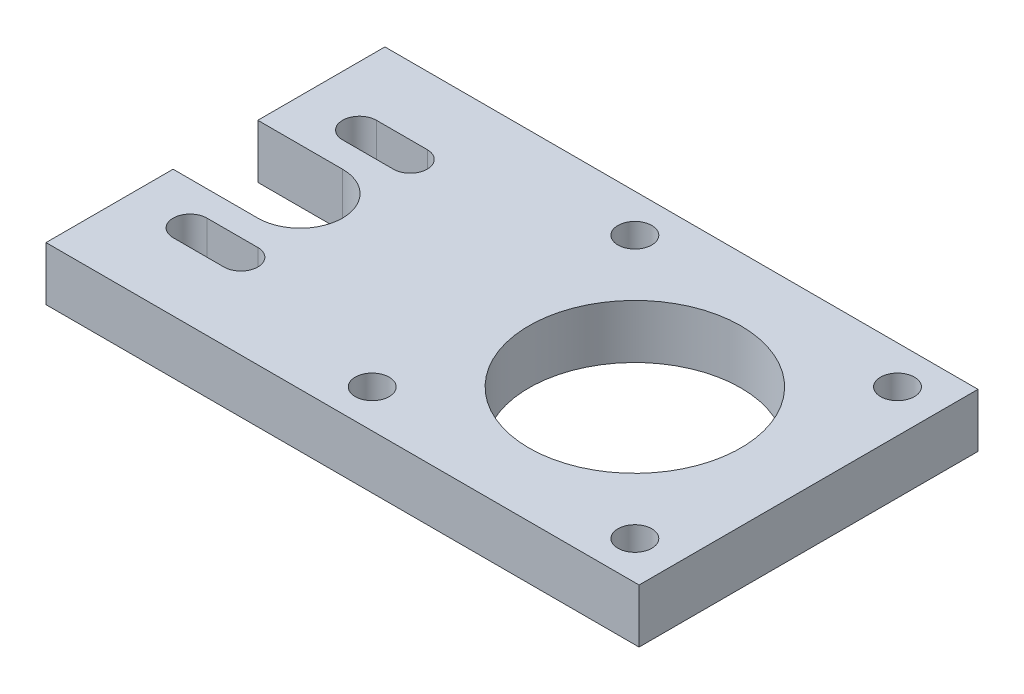
ISO-10303-21;
HEADER;
FILE_DESCRIPTION(('STEP AP214'),'2;1');
FILE_NAME('part.step','',(''),(''),'','','');
FILE_SCHEMA(('AUTOMOTIVE_DESIGN { 1 0 10303 214 1 1 1 1 }'));
ENDSEC;
DATA;
#1=APPLICATION_CONTEXT('core data for automotive mechanical design processes');
#2=APPLICATION_PROTOCOL_DEFINITION('international standard','automotive_design',2000,#1);
#3=PRODUCT_CONTEXT('',#1,'mechanical');
#4=PRODUCT('Part','Part','',(#3));
#5=PRODUCT_RELATED_PRODUCT_CATEGORY('part','',(#4));
#6=PRODUCT_DEFINITION_FORMATION('','',#4);
#7=PRODUCT_DEFINITION_CONTEXT('part definition',#1,'design');
#8=PRODUCT_DEFINITION('design','',#6,#7);
#9=PRODUCT_DEFINITION_SHAPE('','',#8);
#10=(LENGTH_UNIT() NAMED_UNIT(*) SI_UNIT(.MILLI.,.METRE.));
#11=(NAMED_UNIT(*) PLANE_ANGLE_UNIT() SI_UNIT($,.RADIAN.));
#12=(NAMED_UNIT(*) SI_UNIT($,.STERADIAN.) SOLID_ANGLE_UNIT());
#13=UNCERTAINTY_MEASURE_WITH_UNIT(LENGTH_MEASURE(1.E-05),#10,'distance_accuracy_value','');
#14=(GEOMETRIC_REPRESENTATION_CONTEXT(3) GLOBAL_UNCERTAINTY_ASSIGNED_CONTEXT((#13)) GLOBAL_UNIT_ASSIGNED_CONTEXT((#10,
#11,#12)) REPRESENTATION_CONTEXT('',''));
#15=CARTESIAN_POINT('',(0.,0.,0.));
#16=DIRECTION('',(0.,0.,1.));
#17=DIRECTION('',(1.,0.,0.));
#18=AXIS2_PLACEMENT_3D('',#15,#16,#17);
#19=CARTESIAN_POINT('',(0.,6.35,0.));
#20=DIRECTION('',(1.,0.,0.));
#21=DIRECTION('',(0.,0.,-1.));
#22=AXIS2_PLACEMENT_3D('',#19,#20,#21);
#23=PLANE('',#22);
#24=DIRECTION('',(0.,0.,1.));
#25=VECTOR('',#24,1.);
#26=CARTESIAN_POINT('',(0.,6.35,0.));
#27=LINE('',#26,#25);
#28=CARTESIAN_POINT('',(0.,6.35,-15.));
#29=VERTEX_POINT('',#28);
#30=CARTESIAN_POINT('',(0.,6.35,0.));
#31=VERTEX_POINT('',#30);
#32=EDGE_CURVE('E275',#29,#31,#27,.T.);
#33=ORIENTED_EDGE('',*,*,#32,.F.);
#34=DIRECTION('',(0.,1.,0.));
#35=VECTOR('',#34,1.);
#36=CARTESIAN_POINT('',(0.,0.,-15.));
#37=LINE('',#36,#35);
#38=CARTESIAN_POINT('',(0.,0.,-15.));
#39=VERTEX_POINT('',#38);
#40=EDGE_CURVE('E235',#39,#29,#37,.T.);
#41=ORIENTED_EDGE('',*,*,#40,.F.);
#42=DIRECTION('',(0.,0.,1.));
#43=VECTOR('',#42,1.);
#44=CARTESIAN_POINT('',(0.,0.,0.));
#45=LINE('',#44,#43);
#46=CARTESIAN_POINT('',(0.,0.,0.));
#47=VERTEX_POINT('',#46);
#48=EDGE_CURVE('E268',#39,#47,#45,.T.);
#49=ORIENTED_EDGE('',*,*,#48,.T.);
#50=DIRECTION('',(0.,-1.,0.));
#51=VECTOR('',#50,1.);
#52=CARTESIAN_POINT('',(0.,6.35,0.));
#53=LINE('',#52,#51);
#54=EDGE_CURVE('E11',#31,#47,#53,.T.);
#55=ORIENTED_EDGE('',*,*,#54,.F.);
#56=EDGE_LOOP('',(#33,#41,#49,#55));
#57=FACE_BOUND('',#56,.T.);
#58=ADVANCED_FACE('F33',(#57),#23,.F.);
#59=CARTESIAN_POINT('',(0.,0.,-40.));
#60=VERTEX_POINT('',#59);
#61=CARTESIAN_POINT('',(0.,0.,-25.));
#62=VERTEX_POINT('',#61);
#63=EDGE_CURVE('E282',#60,#62,#45,.T.);
#64=ORIENTED_EDGE('',*,*,#63,.T.);
#65=DIRECTION('',(0.,1.,0.));
#66=VECTOR('',#65,1.);
#67=CARTESIAN_POINT('',(0.,0.,-25.));
#68=LINE('',#67,#66);
#69=CARTESIAN_POINT('',(0.,6.35,-25.));
#70=VERTEX_POINT('',#69);
#71=EDGE_CURVE('E237',#62,#70,#68,.T.);
#72=ORIENTED_EDGE('',*,*,#71,.T.);
#73=CARTESIAN_POINT('',(0.,6.35,-40.));
#74=VERTEX_POINT('',#73);
#75=EDGE_CURVE('E271',#74,#70,#27,.T.);
#76=ORIENTED_EDGE('',*,*,#75,.F.);
#77=DIRECTION('',(0.,-1.,0.));
#78=VECTOR('',#77,1.);
#79=CARTESIAN_POINT('',(0.,6.35,-40.));
#80=LINE('',#79,#78);
#81=EDGE_CURVE('E281',#74,#60,#80,.T.);
#82=ORIENTED_EDGE('',*,*,#81,.T.);
#83=EDGE_LOOP('',(#64,#72,#76,#82));
#84=FACE_BOUND('',#83,.T.);
#85=ADVANCED_FACE('F35',(#84),#23,.F.);
#86=CARTESIAN_POINT('',(0.,6.35,0.));
#87=DIRECTION('',(0.,0.,-1.));
#88=DIRECTION('',(-1.,0.,0.));
#89=AXIS2_PLACEMENT_3D('',#86,#87,#88);
#90=PLANE('',#89);
#91=DIRECTION('',(1.,0.,0.));
#92=VECTOR('',#91,1.);
#93=CARTESIAN_POINT('',(0.,0.,0.));
#94=LINE('',#93,#92);
#95=CARTESIAN_POINT('',(70.,0.,0.));
#96=VERTEX_POINT('',#95);
#97=EDGE_CURVE('E285',#47,#96,#94,.T.);
#98=ORIENTED_EDGE('',*,*,#97,.T.);
#99=DIRECTION('',(0.,-1.,0.));
#100=VECTOR('',#99,1.);
#101=CARTESIAN_POINT('',(70.,6.35,0.));
#102=LINE('',#101,#100);
#103=CARTESIAN_POINT('',(70.,6.35,0.));
#104=VERTEX_POINT('',#103);
#105=EDGE_CURVE('E41',#104,#96,#102,.T.);
#106=ORIENTED_EDGE('',*,*,#105,.F.);
#107=DIRECTION('',(1.,0.,0.));
#108=VECTOR('',#107,1.);
#109=CARTESIAN_POINT('',(0.,6.35,0.));
#110=LINE('',#109,#108);
#111=EDGE_CURVE('E274',#31,#104,#110,.T.);
#112=ORIENTED_EDGE('',*,*,#111,.F.);
#113=ORIENTED_EDGE('',*,*,#54,.T.);
#114=EDGE_LOOP('',(#98,#106,#112,#113));
#115=FACE_BOUND('',#114,.T.);
#116=ADVANCED_FACE('F323',(#115),#90,.F.);
#117=CARTESIAN_POINT('',(70.,6.35,0.));
#118=DIRECTION('',(-1.,0.,0.));
#119=DIRECTION('',(0.,0.,1.));
#120=AXIS2_PLACEMENT_3D('',#117,#118,#119);
#121=PLANE('',#120);
#122=DIRECTION('',(0.,0.,-1.));
#123=VECTOR('',#122,1.);
#124=CARTESIAN_POINT('',(70.,0.,0.));
#125=LINE('',#124,#123);
#126=CARTESIAN_POINT('',(70.,0.,-40.));
#127=VERTEX_POINT('',#126);
#128=EDGE_CURVE('E287',#96,#127,#125,.T.);
#129=ORIENTED_EDGE('',*,*,#128,.T.);
#130=DIRECTION('',(0.,-1.,0.));
#131=VECTOR('',#130,1.);
#132=CARTESIAN_POINT('',(70.,6.35,-40.));
#133=LINE('',#132,#131);
#134=CARTESIAN_POINT('',(70.,6.35,-40.));
#135=VERTEX_POINT('',#134);
#136=EDGE_CURVE('E293',#135,#127,#133,.T.);
#137=ORIENTED_EDGE('',*,*,#136,.F.);
#138=DIRECTION('',(0.,0.,-1.));
#139=VECTOR('',#138,1.);
#140=CARTESIAN_POINT('',(70.,6.35,0.));
#141=LINE('',#140,#139);
#142=EDGE_CURVE('E277',#104,#135,#141,.T.);
#143=ORIENTED_EDGE('',*,*,#142,.F.);
#144=ORIENTED_EDGE('',*,*,#105,.T.);
#145=EDGE_LOOP('',(#129,#137,#143,#144));
#146=FACE_BOUND('',#145,.T.);
#147=ADVANCED_FACE('F300',(#146),#121,.F.);
#148=CARTESIAN_POINT('',(0.,6.35,-40.));
#149=DIRECTION('',(0.,0.,1.));
#150=DIRECTION('',(1.,0.,0.));
#151=AXIS2_PLACEMENT_3D('',#148,#149,#150);
#152=PLANE('',#151);
#153=DIRECTION('',(-1.,0.,0.));
#154=VECTOR('',#153,1.);
#155=CARTESIAN_POINT('',(0.,0.,-40.));
#156=LINE('',#155,#154);
#157=EDGE_CURVE('E289',#127,#60,#156,.T.);
#158=ORIENTED_EDGE('',*,*,#157,.T.);
#159=ORIENTED_EDGE('',*,*,#81,.F.);
#160=DIRECTION('',(-1.,0.,0.));
#161=VECTOR('',#160,1.);
#162=CARTESIAN_POINT('',(0.,6.35,-40.));
#163=LINE('',#162,#161);
#164=EDGE_CURVE('E279',#135,#74,#163,.T.);
#165=ORIENTED_EDGE('',*,*,#164,.F.);
#166=ORIENTED_EDGE('',*,*,#136,.T.);
#167=EDGE_LOOP('',(#158,#159,#165,#166));
#168=FACE_BOUND('',#167,.T.);
#169=ADVANCED_FACE('F312',(#168),#152,.F.);
#170=CARTESIAN_POINT('',(0.,6.35,0.));
#171=DIRECTION('',(0.,-1.,0.));
#172=DIRECTION('',(0.,0.,-1.));
#173=AXIS2_PLACEMENT_3D('',#170,#171,#172);
#174=PLANE('',#173);
#175=DIRECTION('',(1.,0.,0.));
#176=VECTOR('',#175,1.);
#177=CARTESIAN_POINT('',(7.,6.35,-8.));
#178=LINE('',#177,#176);
#179=CARTESIAN_POINT('',(7.,6.35,-8.));
#180=VERTEX_POINT('',#179);
#181=CARTESIAN_POINT('',(13.,6.35,-8.));
#182=VERTEX_POINT('',#181);
#183=EDGE_CURVE('E173',#180,#182,#178,.T.);
#184=ORIENTED_EDGE('',*,*,#183,.F.);
#185=CARTESIAN_POINT('',(7.,6.35,-10.));
#186=DIRECTION('',(0.,1.,0.));
#187=DIRECTION('',(0.,0.,1.));
#188=AXIS2_PLACEMENT_3D('',#185,#186,#187);
#189=CIRCLE('',#188,2.);
#190=CARTESIAN_POINT('',(7.,6.35,-12.));
#191=VERTEX_POINT('',#190);
#192=EDGE_CURVE('E48',#191,#180,#189,.T.);
#193=ORIENTED_EDGE('',*,*,#192,.F.);
#194=DIRECTION('',(-1.,0.,0.));
#195=VECTOR('',#194,1.);
#196=CARTESIAN_POINT('',(7.,6.35,-12.));
#197=LINE('',#196,#195);
#198=CARTESIAN_POINT('',(13.,6.35,-12.));
#199=VERTEX_POINT('',#198);
#200=EDGE_CURVE('E164',#199,#191,#197,.T.);
#201=ORIENTED_EDGE('',*,*,#200,.F.);
#202=CARTESIAN_POINT('',(13.,6.35,-10.));
#203=DIRECTION('',(0.,1.,0.));
#204=DIRECTION('',(0.,0.,1.));
#205=AXIS2_PLACEMENT_3D('',#202,#203,#204);
#206=CIRCLE('',#205,2.);
#207=EDGE_CURVE('E167',#182,#199,#206,.T.);
#208=ORIENTED_EDGE('',*,*,#207,.F.);
#209=EDGE_LOOP('',(#184,#193,#201,#208));
#210=FACE_BOUND('',#209,.T.);
#211=DIRECTION('',(-1.,0.,0.));
#212=VECTOR('',#211,1.);
#213=CARTESIAN_POINT('',(13.,6.35,-32.));
#214=LINE('',#213,#212);
#215=CARTESIAN_POINT('',(13.,6.35,-32.));
#216=VERTEX_POINT('',#215);
#217=CARTESIAN_POINT('',(7.,6.35,-32.));
#218=VERTEX_POINT('',#217);
#219=EDGE_CURVE('E198',#216,#218,#214,.T.);
#220=ORIENTED_EDGE('',*,*,#219,.F.);
#221=CARTESIAN_POINT('',(13.,6.35,-30.));
#222=DIRECTION('',(0.,1.,0.));
#223=DIRECTION('',(0.,0.,1.));
#224=AXIS2_PLACEMENT_3D('',#221,#222,#223);
#225=CIRCLE('',#224,2.);
#226=CARTESIAN_POINT('',(13.,6.35,-28.));
#227=VERTEX_POINT('',#226);
#228=EDGE_CURVE('E179',#227,#216,#225,.T.);
#229=ORIENTED_EDGE('',*,*,#228,.F.);
#230=DIRECTION('',(1.,0.,0.));
#231=VECTOR('',#230,1.);
#232=CARTESIAN_POINT('',(13.,6.35,-28.));
#233=LINE('',#232,#231);
#234=CARTESIAN_POINT('',(7.,6.35,-28.));
#235=VERTEX_POINT('',#234);
#236=EDGE_CURVE('E187',#235,#227,#233,.T.);
#237=ORIENTED_EDGE('',*,*,#236,.F.);
#238=CARTESIAN_POINT('',(7.,6.35,-30.));
#239=DIRECTION('',(0.,1.,0.));
#240=DIRECTION('',(0.,0.,1.));
#241=AXIS2_PLACEMENT_3D('',#238,#239,#240);
#242=CIRCLE('',#241,2.);
#243=EDGE_CURVE('E201',#218,#235,#242,.T.);
#244=ORIENTED_EDGE('',*,*,#243,.F.);
#245=EDGE_LOOP('',(#220,#229,#237,#244));
#246=FACE_BOUND('',#245,.T.);
#247=CARTESIAN_POINT('',(34.,6.35,-4.5));
#248=DIRECTION('',(0.,1.,0.));
#249=DIRECTION('',(0.,0.,1.));
#250=AXIS2_PLACEMENT_3D('',#247,#248,#249);
#251=CIRCLE('',#250,2.);
#252=CARTESIAN_POINT('',(34.,6.35,-2.49999999999999));
#253=VERTEX_POINT('',#252);
#254=EDGE_CURVE('E234',#253,#253,#251,.T.);
#255=ORIENTED_EDGE('',*,*,#254,.F.);
#256=EDGE_LOOP('',(#255));
#257=FACE_BOUND('',#256,.T.);
#258=CARTESIAN_POINT('',(65.,6.35,-4.5));
#259=DIRECTION('',(0.,1.,0.));
#260=DIRECTION('',(0.,0.,1.));
#261=AXIS2_PLACEMENT_3D('',#258,#259,#260);
#262=CIRCLE('',#261,2.);
#263=CARTESIAN_POINT('',(65.,6.35,-2.5));
#264=VERTEX_POINT('',#263);
#265=EDGE_CURVE('E244',#264,#264,#262,.T.);
#266=ORIENTED_EDGE('',*,*,#265,.F.);
#267=EDGE_LOOP('',(#266));
#268=FACE_BOUND('',#267,.T.);
#269=CARTESIAN_POINT('',(65.,6.35,-35.5));
#270=DIRECTION('',(0.,1.,0.));
#271=DIRECTION('',(0.,0.,1.));
#272=AXIS2_PLACEMENT_3D('',#269,#270,#271);
#273=CIRCLE('',#272,2.);
#274=CARTESIAN_POINT('',(65.,6.35,-33.5));
#275=VERTEX_POINT('',#274);
#276=EDGE_CURVE('E250',#275,#275,#273,.T.);
#277=ORIENTED_EDGE('',*,*,#276,.F.);
#278=EDGE_LOOP('',(#277));
#279=FACE_BOUND('',#278,.T.);
#280=CARTESIAN_POINT('',(34.,6.35,-35.5));
#281=DIRECTION('',(0.,1.,0.));
#282=DIRECTION('',(0.,0.,1.));
#283=AXIS2_PLACEMENT_3D('',#280,#281,#282);
#284=CIRCLE('',#283,2.);
#285=CARTESIAN_POINT('',(34.,6.35,-33.5));
#286=VERTEX_POINT('',#285);
#287=EDGE_CURVE('E256',#286,#286,#284,.T.);
#288=ORIENTED_EDGE('',*,*,#287,.F.);
#289=EDGE_LOOP('',(#288));
#290=FACE_BOUND('',#289,.T.);
#291=CARTESIAN_POINT('',(49.5,6.35,-20.));
#292=DIRECTION('',(0.,1.,0.));
#293=DIRECTION('',(0.,0.,1.));
#294=AXIS2_PLACEMENT_3D('',#291,#292,#293);
#295=CIRCLE('',#294,12.5);
#296=CARTESIAN_POINT('',(49.5,6.35,-7.50000000000001));
#297=VERTEX_POINT('',#296);
#298=EDGE_CURVE('E262',#297,#297,#295,.T.);
#299=ORIENTED_EDGE('',*,*,#298,.F.);
#300=EDGE_LOOP('',(#299));
#301=FACE_BOUND('',#300,.T.);
#302=CARTESIAN_POINT('',(10.,6.35,-20.));
#303=DIRECTION('',(0.,1.,0.));
#304=DIRECTION('',(0.,0.,1.));
#305=AXIS2_PLACEMENT_3D('',#302,#303,#304);
#306=CIRCLE('',#305,5.);
#307=CARTESIAN_POINT('',(10.,6.35,-15.));
#308=VERTEX_POINT('',#307);
#309=CARTESIAN_POINT('',(10.,6.35,-25.));
#310=VERTEX_POINT('',#309);
#311=EDGE_CURVE('E208',#308,#310,#306,.T.);
#312=ORIENTED_EDGE('',*,*,#311,.F.);
#313=DIRECTION('',(1.,0.,0.));
#314=VECTOR('',#313,1.);
#315=CARTESIAN_POINT('',(10.,6.35,-15.));
#316=LINE('',#315,#314);
#317=EDGE_CURVE('E219',#29,#308,#316,.T.);
#318=ORIENTED_EDGE('',*,*,#317,.F.);
#319=ORIENTED_EDGE('',*,*,#32,.T.);
#320=ORIENTED_EDGE('',*,*,#111,.T.);
#321=ORIENTED_EDGE('',*,*,#142,.T.);
#322=ORIENTED_EDGE('',*,*,#164,.T.);
#323=ORIENTED_EDGE('',*,*,#75,.T.);
#324=DIRECTION('',(-1.,0.,0.));
#325=VECTOR('',#324,1.);
#326=CARTESIAN_POINT('',(10.,6.35,-25.));
#327=LINE('',#326,#325);
#328=EDGE_CURVE('E228',#310,#70,#327,.T.);
#329=ORIENTED_EDGE('',*,*,#328,.F.);
#330=EDGE_LOOP('',(#312,#318,#319,#320,#321,#322,#323,#329));
#331=FACE_BOUND('',#330,.T.);
#332=ADVANCED_FACE('F319',(#210,#246,#257,#268,#279,#290,#301,#331),#174,.F.);
#333=CARTESIAN_POINT('',(0.,0.,0.));
#334=DIRECTION('',(0.,-1.,0.));
#335=DIRECTION('',(0.,0.,-1.));
#336=AXIS2_PLACEMENT_3D('',#333,#334,#335);
#337=PLANE('',#336);
#338=CARTESIAN_POINT('',(7.,0.,-10.));
#339=DIRECTION('',(0.,1.,0.));
#340=DIRECTION('',(0.,0.,1.));
#341=AXIS2_PLACEMENT_3D('',#338,#339,#340);
#342=CIRCLE('',#341,2.);
#343=CARTESIAN_POINT('',(7.,0.,-12.));
#344=VERTEX_POINT('',#343);
#345=CARTESIAN_POINT('',(7.,0.,-8.));
#346=VERTEX_POINT('',#345);
#347=EDGE_CURVE('E148',#344,#346,#342,.T.);
#348=ORIENTED_EDGE('',*,*,#347,.T.);
#349=DIRECTION('',(1.,0.,0.));
#350=VECTOR('',#349,1.);
#351=CARTESIAN_POINT('',(7.,0.,-8.));
#352=LINE('',#351,#350);
#353=CARTESIAN_POINT('',(13.,0.,-8.));
#354=VERTEX_POINT('',#353);
#355=EDGE_CURVE('E157',#346,#354,#352,.T.);
#356=ORIENTED_EDGE('',*,*,#355,.T.);
#357=CARTESIAN_POINT('',(13.,0.,-10.));
#358=DIRECTION('',(0.,1.,0.));
#359=DIRECTION('',(0.,0.,1.));
#360=AXIS2_PLACEMENT_3D('',#357,#358,#359);
#361=CIRCLE('',#360,2.);
#362=CARTESIAN_POINT('',(13.,0.,-12.));
#363=VERTEX_POINT('',#362);
#364=EDGE_CURVE('E56',#354,#363,#361,.T.);
#365=ORIENTED_EDGE('',*,*,#364,.T.);
#366=DIRECTION('',(-1.,0.,0.));
#367=VECTOR('',#366,1.);
#368=CARTESIAN_POINT('',(7.,0.,-12.));
#369=LINE('',#368,#367);
#370=EDGE_CURVE('E154',#363,#344,#369,.T.);
#371=ORIENTED_EDGE('',*,*,#370,.T.);
#372=EDGE_LOOP('',(#348,#356,#365,#371));
#373=FACE_BOUND('',#372,.T.);
#374=CARTESIAN_POINT('',(13.,0.,-30.));
#375=DIRECTION('',(0.,1.,0.));
#376=DIRECTION('',(0.,0.,1.));
#377=AXIS2_PLACEMENT_3D('',#374,#375,#376);
#378=CIRCLE('',#377,2.);
#379=CARTESIAN_POINT('',(13.,0.,-28.));
#380=VERTEX_POINT('',#379);
#381=CARTESIAN_POINT('',(13.,0.,-32.));
#382=VERTEX_POINT('',#381);
#383=EDGE_CURVE('E183',#380,#382,#378,.T.);
#384=ORIENTED_EDGE('',*,*,#383,.T.);
#385=DIRECTION('',(-1.,0.,0.));
#386=VECTOR('',#385,1.);
#387=CARTESIAN_POINT('',(13.,0.,-32.));
#388=LINE('',#387,#386);
#389=CARTESIAN_POINT('',(7.,0.,-32.));
#390=VERTEX_POINT('',#389);
#391=EDGE_CURVE('E186',#382,#390,#388,.T.);
#392=ORIENTED_EDGE('',*,*,#391,.T.);
#393=CARTESIAN_POINT('',(7.,0.,-30.));
#394=DIRECTION('',(0.,1.,0.));
#395=DIRECTION('',(0.,0.,1.));
#396=AXIS2_PLACEMENT_3D('',#393,#394,#395);
#397=CIRCLE('',#396,2.);
#398=CARTESIAN_POINT('',(7.,0.,-28.));
#399=VERTEX_POINT('',#398);
#400=EDGE_CURVE('E190',#390,#399,#397,.T.);
#401=ORIENTED_EDGE('',*,*,#400,.T.);
#402=DIRECTION('',(1.,0.,0.));
#403=VECTOR('',#402,1.);
#404=CARTESIAN_POINT('',(13.,0.,-28.));
#405=LINE('',#404,#403);
#406=EDGE_CURVE('E193',#399,#380,#405,.T.);
#407=ORIENTED_EDGE('',*,*,#406,.T.);
#408=EDGE_LOOP('',(#384,#392,#401,#407));
#409=FACE_BOUND('',#408,.T.);
#410=DIRECTION('',(1.,0.,0.));
#411=VECTOR('',#410,1.);
#412=CARTESIAN_POINT('',(10.,0.,-15.));
#413=LINE('',#412,#411);
#414=CARTESIAN_POINT('',(10.,0.,-15.));
#415=VERTEX_POINT('',#414);
#416=EDGE_CURVE('E222',#39,#415,#413,.T.);
#417=ORIENTED_EDGE('',*,*,#416,.T.);
#418=CARTESIAN_POINT('',(10.,0.,-20.));
#419=DIRECTION('',(0.,1.,0.));
#420=DIRECTION('',(0.,0.,1.));
#421=AXIS2_PLACEMENT_3D('',#418,#419,#420);
#422=CIRCLE('',#421,5.);
#423=CARTESIAN_POINT('',(10.,0.,-25.));
#424=VERTEX_POINT('',#423);
#425=EDGE_CURVE('E215',#415,#424,#422,.T.);
#426=ORIENTED_EDGE('',*,*,#425,.T.);
#427=DIRECTION('',(-1.,0.,0.));
#428=VECTOR('',#427,1.);
#429=CARTESIAN_POINT('',(10.,0.,-25.));
#430=LINE('',#429,#428);
#431=EDGE_CURVE('E218',#424,#62,#430,.T.);
#432=ORIENTED_EDGE('',*,*,#431,.T.);
#433=ORIENTED_EDGE('',*,*,#63,.F.);
#434=ORIENTED_EDGE('',*,*,#157,.F.);
#435=ORIENTED_EDGE('',*,*,#128,.F.);
#436=ORIENTED_EDGE('',*,*,#97,.F.);
#437=ORIENTED_EDGE('',*,*,#48,.F.);
#438=EDGE_LOOP('',(#417,#426,#432,#433,#434,#435,#436,#437));
#439=FACE_BOUND('',#438,.T.);
#440=CARTESIAN_POINT('',(34.,0.,-4.5));
#441=DIRECTION('',(0.,1.,0.));
#442=DIRECTION('',(0.,0.,1.));
#443=AXIS2_PLACEMENT_3D('',#440,#441,#442);
#444=CIRCLE('',#443,2.);
#445=CARTESIAN_POINT('',(34.,0.,-2.49999999999999));
#446=VERTEX_POINT('',#445);
#447=EDGE_CURVE('E241',#446,#446,#444,.T.);
#448=ORIENTED_EDGE('',*,*,#447,.T.);
#449=EDGE_LOOP('',(#448));
#450=FACE_BOUND('',#449,.T.);
#451=CARTESIAN_POINT('',(65.,0.,-4.5));
#452=DIRECTION('',(0.,1.,0.));
#453=DIRECTION('',(0.,0.,1.));
#454=AXIS2_PLACEMENT_3D('',#451,#452,#453);
#455=CIRCLE('',#454,2.);
#456=CARTESIAN_POINT('',(65.,0.,-2.5));
#457=VERTEX_POINT('',#456);
#458=EDGE_CURVE('E247',#457,#457,#455,.T.);
#459=ORIENTED_EDGE('',*,*,#458,.T.);
#460=EDGE_LOOP('',(#459));
#461=FACE_BOUND('',#460,.T.);
#462=CARTESIAN_POINT('',(65.,0.,-35.5));
#463=DIRECTION('',(0.,1.,0.));
#464=DIRECTION('',(0.,0.,1.));
#465=AXIS2_PLACEMENT_3D('',#462,#463,#464);
#466=CIRCLE('',#465,2.);
#467=CARTESIAN_POINT('',(65.,0.,-33.5));
#468=VERTEX_POINT('',#467);
#469=EDGE_CURVE('E253',#468,#468,#466,.T.);
#470=ORIENTED_EDGE('',*,*,#469,.T.);
#471=EDGE_LOOP('',(#470));
#472=FACE_BOUND('',#471,.T.);
#473=CARTESIAN_POINT('',(34.,0.,-35.5));
#474=DIRECTION('',(0.,1.,0.));
#475=DIRECTION('',(0.,0.,1.));
#476=AXIS2_PLACEMENT_3D('',#473,#474,#475);
#477=CIRCLE('',#476,2.);
#478=CARTESIAN_POINT('',(34.,0.,-33.5));
#479=VERTEX_POINT('',#478);
#480=EDGE_CURVE('E259',#479,#479,#477,.T.);
#481=ORIENTED_EDGE('',*,*,#480,.T.);
#482=EDGE_LOOP('',(#481));
#483=FACE_BOUND('',#482,.T.);
#484=CARTESIAN_POINT('',(49.5,0.,-20.));
#485=DIRECTION('',(0.,1.,0.));
#486=DIRECTION('',(0.,0.,1.));
#487=AXIS2_PLACEMENT_3D('',#484,#485,#486);
#488=CIRCLE('',#487,12.5);
#489=CARTESIAN_POINT('',(49.5,0.,-7.50000000000001));
#490=VERTEX_POINT('',#489);
#491=EDGE_CURVE('E265',#490,#490,#488,.T.);
#492=ORIENTED_EDGE('',*,*,#491,.T.);
#493=EDGE_LOOP('',(#492));
#494=FACE_BOUND('',#493,.T.);
#495=ADVANCED_FACE('F161',(#373,#409,#439,#450,#461,#472,#483,#494),#337,.T.);
#496=CARTESIAN_POINT('',(49.5,0.,-20.));
#497=DIRECTION('',(0.,1.,0.));
#498=DIRECTION('',(0.,0.,1.));
#499=AXIS2_PLACEMENT_3D('',#496,#497,#498);
#500=CYLINDRICAL_SURFACE('',#499,12.5);
#501=ORIENTED_EDGE('',*,*,#491,.F.);
#502=EDGE_LOOP('',(#501));
#503=FACE_BOUND('',#502,.T.);
#504=ORIENTED_EDGE('',*,*,#298,.T.);
#505=EDGE_LOOP('',(#504));
#506=FACE_BOUND('',#505,.T.);
#507=ADVANCED_FACE('F362',(#503,#506),#500,.F.);
#508=CARTESIAN_POINT('',(34.,0.,-35.5));
#509=DIRECTION('',(0.,1.,0.));
#510=DIRECTION('',(0.,0.,1.));
#511=AXIS2_PLACEMENT_3D('',#508,#509,#510);
#512=CYLINDRICAL_SURFACE('',#511,2.);
#513=ORIENTED_EDGE('',*,*,#480,.F.);
#514=EDGE_LOOP('',(#513));
#515=FACE_BOUND('',#514,.T.);
#516=ORIENTED_EDGE('',*,*,#287,.T.);
#517=EDGE_LOOP('',(#516));
#518=FACE_BOUND('',#517,.T.);
#519=ADVANCED_FACE('F368',(#515,#518),#512,.F.);
#520=CARTESIAN_POINT('',(65.,0.,-35.5));
#521=DIRECTION('',(0.,1.,0.));
#522=DIRECTION('',(0.,0.,1.));
#523=AXIS2_PLACEMENT_3D('',#520,#521,#522);
#524=CYLINDRICAL_SURFACE('',#523,2.);
#525=ORIENTED_EDGE('',*,*,#469,.F.);
#526=EDGE_LOOP('',(#525));
#527=FACE_BOUND('',#526,.T.);
#528=ORIENTED_EDGE('',*,*,#276,.T.);
#529=EDGE_LOOP('',(#528));
#530=FACE_BOUND('',#529,.T.);
#531=ADVANCED_FACE('F372',(#527,#530),#524,.F.);
#532=CARTESIAN_POINT('',(65.,0.,-4.5));
#533=DIRECTION('',(0.,1.,0.));
#534=DIRECTION('',(0.,0.,1.));
#535=AXIS2_PLACEMENT_3D('',#532,#533,#534);
#536=CYLINDRICAL_SURFACE('',#535,2.);
#537=ORIENTED_EDGE('',*,*,#458,.F.);
#538=EDGE_LOOP('',(#537));
#539=FACE_BOUND('',#538,.T.);
#540=ORIENTED_EDGE('',*,*,#265,.T.);
#541=EDGE_LOOP('',(#540));
#542=FACE_BOUND('',#541,.T.);
#543=ADVANCED_FACE('F376',(#539,#542),#536,.F.);
#544=CARTESIAN_POINT('',(34.,0.,-4.5));
#545=DIRECTION('',(0.,1.,0.));
#546=DIRECTION('',(0.,0.,1.));
#547=AXIS2_PLACEMENT_3D('',#544,#545,#546);
#548=CYLINDRICAL_SURFACE('',#547,2.);
#549=ORIENTED_EDGE('',*,*,#447,.F.);
#550=EDGE_LOOP('',(#549));
#551=FACE_BOUND('',#550,.T.);
#552=ORIENTED_EDGE('',*,*,#254,.T.);
#553=EDGE_LOOP('',(#552));
#554=FACE_BOUND('',#553,.T.);
#555=ADVANCED_FACE('F380',(#551,#554),#548,.F.);
#556=CARTESIAN_POINT('',(10.,0.,-20.));
#557=DIRECTION('',(0.,1.,0.));
#558=DIRECTION('',(0.,0.,1.));
#559=AXIS2_PLACEMENT_3D('',#556,#557,#558);
#560=CYLINDRICAL_SURFACE('',#559,5.);
#561=ORIENTED_EDGE('',*,*,#311,.T.);
#562=DIRECTION('',(0.,1.,0.));
#563=VECTOR('',#562,1.);
#564=CARTESIAN_POINT('',(10.,0.,-25.));
#565=LINE('',#564,#563);
#566=EDGE_CURVE('E225',#424,#310,#565,.T.);
#567=ORIENTED_EDGE('',*,*,#566,.F.);
#568=ORIENTED_EDGE('',*,*,#425,.F.);
#569=DIRECTION('',(0.,1.,0.));
#570=VECTOR('',#569,1.);
#571=CARTESIAN_POINT('',(10.,0.,-15.));
#572=LINE('',#571,#570);
#573=EDGE_CURVE('E232',#415,#308,#572,.T.);
#574=ORIENTED_EDGE('',*,*,#573,.T.);
#575=EDGE_LOOP('',(#561,#567,#568,#574));
#576=FACE_BOUND('',#575,.T.);
#577=ADVANCED_FACE('F330',(#576),#560,.F.);
#578=CARTESIAN_POINT('',(10.,0.,-15.));
#579=DIRECTION('',(0.,0.,1.));
#580=DIRECTION('',(1.,0.,0.));
#581=AXIS2_PLACEMENT_3D('',#578,#579,#580);
#582=PLANE('',#581);
#583=ORIENTED_EDGE('',*,*,#317,.T.);
#584=ORIENTED_EDGE('',*,*,#573,.F.);
#585=ORIENTED_EDGE('',*,*,#416,.F.);
#586=ORIENTED_EDGE('',*,*,#40,.T.);
#587=EDGE_LOOP('',(#583,#584,#585,#586));
#588=FACE_BOUND('',#587,.T.);
#589=ADVANCED_FACE('F328',(#588),#582,.F.);
#590=CARTESIAN_POINT('',(10.,0.,-25.));
#591=DIRECTION('',(0.,0.,-1.));
#592=DIRECTION('',(-1.,0.,0.));
#593=AXIS2_PLACEMENT_3D('',#590,#591,#592);
#594=PLANE('',#593);
#595=ORIENTED_EDGE('',*,*,#328,.T.);
#596=ORIENTED_EDGE('',*,*,#71,.F.);
#597=ORIENTED_EDGE('',*,*,#431,.F.);
#598=ORIENTED_EDGE('',*,*,#566,.T.);
#599=EDGE_LOOP('',(#595,#596,#597,#598));
#600=FACE_BOUND('',#599,.T.);
#601=ADVANCED_FACE('F333',(#600),#594,.F.);
#602=CARTESIAN_POINT('',(13.,0.,-30.));
#603=DIRECTION('',(0.,1.,0.));
#604=DIRECTION('',(0.,0.,1.));
#605=AXIS2_PLACEMENT_3D('',#602,#603,#604);
#606=CYLINDRICAL_SURFACE('',#605,2.);
#607=ORIENTED_EDGE('',*,*,#228,.T.);
#608=DIRECTION('',(0.,1.,0.));
#609=VECTOR('',#608,1.);
#610=CARTESIAN_POINT('',(13.,0.,-32.));
#611=LINE('',#610,#609);
#612=EDGE_CURVE('E196',#382,#216,#611,.T.);
#613=ORIENTED_EDGE('',*,*,#612,.F.);
#614=ORIENTED_EDGE('',*,*,#383,.F.);
#615=DIRECTION('',(0.,1.,0.));
#616=VECTOR('',#615,1.);
#617=CARTESIAN_POINT('',(13.,0.,-28.));
#618=LINE('',#617,#616);
#619=EDGE_CURVE('E206',#380,#227,#618,.T.);
#620=ORIENTED_EDGE('',*,*,#619,.T.);
#621=EDGE_LOOP('',(#607,#613,#614,#620));
#622=FACE_BOUND('',#621,.T.);
#623=ADVANCED_FACE('F335',(#622),#606,.F.);
#624=CARTESIAN_POINT('',(13.,0.,-28.));
#625=DIRECTION('',(0.,0.,1.));
#626=DIRECTION('',(1.,0.,0.));
#627=AXIS2_PLACEMENT_3D('',#624,#625,#626);
#628=PLANE('',#627);
#629=ORIENTED_EDGE('',*,*,#236,.T.);
#630=ORIENTED_EDGE('',*,*,#619,.F.);
#631=ORIENTED_EDGE('',*,*,#406,.F.);
#632=DIRECTION('',(0.,1.,0.));
#633=VECTOR('',#632,1.);
#634=CARTESIAN_POINT('',(7.,0.,-28.));
#635=LINE('',#634,#633);
#636=EDGE_CURVE('E209',#399,#235,#635,.T.);
#637=ORIENTED_EDGE('',*,*,#636,.T.);
#638=EDGE_LOOP('',(#629,#630,#631,#637));
#639=FACE_BOUND('',#638,.T.);
#640=ADVANCED_FACE('F341',(#639),#628,.F.);
#641=CARTESIAN_POINT('',(7.,0.,-30.));
#642=DIRECTION('',(0.,1.,0.));
#643=DIRECTION('',(0.,0.,1.));
#644=AXIS2_PLACEMENT_3D('',#641,#642,#643);
#645=CYLINDRICAL_SURFACE('',#644,2.);
#646=ORIENTED_EDGE('',*,*,#243,.T.);
#647=ORIENTED_EDGE('',*,*,#636,.F.);
#648=ORIENTED_EDGE('',*,*,#400,.F.);
#649=DIRECTION('',(0.,1.,0.));
#650=VECTOR('',#649,1.);
#651=CARTESIAN_POINT('',(7.,0.,-32.));
#652=LINE('',#651,#650);
#653=EDGE_CURVE('E211',#390,#218,#652,.T.);
#654=ORIENTED_EDGE('',*,*,#653,.T.);
#655=EDGE_LOOP('',(#646,#647,#648,#654));
#656=FACE_BOUND('',#655,.T.);
#657=ADVANCED_FACE('F412',(#656),#645,.F.);
#658=CARTESIAN_POINT('',(13.,0.,-32.));
#659=DIRECTION('',(0.,0.,-1.));
#660=DIRECTION('',(-1.,0.,0.));
#661=AXIS2_PLACEMENT_3D('',#658,#659,#660);
#662=PLANE('',#661);
#663=ORIENTED_EDGE('',*,*,#219,.T.);
#664=ORIENTED_EDGE('',*,*,#653,.F.);
#665=ORIENTED_EDGE('',*,*,#391,.F.);
#666=ORIENTED_EDGE('',*,*,#612,.T.);
#667=EDGE_LOOP('',(#663,#664,#665,#666));
#668=FACE_BOUND('',#667,.T.);
#669=ADVANCED_FACE('F422',(#668),#662,.F.);
#670=CARTESIAN_POINT('',(7.,0.,-10.));
#671=DIRECTION('',(0.,1.,0.));
#672=DIRECTION('',(0.,0.,1.));
#673=AXIS2_PLACEMENT_3D('',#670,#671,#672);
#674=CYLINDRICAL_SURFACE('',#673,2.);
#675=ORIENTED_EDGE('',*,*,#192,.T.);
#676=DIRECTION('',(0.,1.,0.));
#677=VECTOR('',#676,1.);
#678=CARTESIAN_POINT('',(7.,0.,-8.));
#679=LINE('',#678,#677);
#680=EDGE_CURVE('E144',#346,#180,#679,.T.);
#681=ORIENTED_EDGE('',*,*,#680,.F.);
#682=ORIENTED_EDGE('',*,*,#347,.F.);
#683=DIRECTION('',(0.,1.,0.));
#684=VECTOR('',#683,1.);
#685=CARTESIAN_POINT('',(7.,0.,-12.));
#686=LINE('',#685,#684);
#687=EDGE_CURVE('E177',#344,#191,#686,.T.);
#688=ORIENTED_EDGE('',*,*,#687,.T.);
#689=EDGE_LOOP('',(#675,#681,#682,#688));
#690=FACE_BOUND('',#689,.T.);
#691=ADVANCED_FACE('F146',(#690),#674,.F.);
#692=CARTESIAN_POINT('',(7.,0.,-12.));
#693=DIRECTION('',(0.,0.,-1.));
#694=DIRECTION('',(-1.,0.,0.));
#695=AXIS2_PLACEMENT_3D('',#692,#693,#694);
#696=PLANE('',#695);
#697=ORIENTED_EDGE('',*,*,#200,.T.);
#698=ORIENTED_EDGE('',*,*,#687,.F.);
#699=ORIENTED_EDGE('',*,*,#370,.F.);
#700=DIRECTION('',(0.,1.,0.));
#701=VECTOR('',#700,1.);
#702=CARTESIAN_POINT('',(13.,0.,-12.));
#703=LINE('',#702,#701);
#704=EDGE_CURVE('E180',#363,#199,#703,.T.);
#705=ORIENTED_EDGE('',*,*,#704,.T.);
#706=EDGE_LOOP('',(#697,#698,#699,#705));
#707=FACE_BOUND('',#706,.T.);
#708=ADVANCED_FACE('F441',(#707),#696,.F.);
#709=CARTESIAN_POINT('',(13.,0.,-10.));
#710=DIRECTION('',(0.,1.,0.));
#711=DIRECTION('',(0.,0.,1.));
#712=AXIS2_PLACEMENT_3D('',#709,#710,#711);
#713=CYLINDRICAL_SURFACE('',#712,2.);
#714=ORIENTED_EDGE('',*,*,#207,.T.);
#715=ORIENTED_EDGE('',*,*,#704,.F.);
#716=ORIENTED_EDGE('',*,*,#364,.F.);
#717=DIRECTION('',(0.,1.,0.));
#718=VECTOR('',#717,1.);
#719=CARTESIAN_POINT('',(13.,0.,-8.));
#720=LINE('',#719,#718);
#721=EDGE_CURVE('E153',#354,#182,#720,.T.);
#722=ORIENTED_EDGE('',*,*,#721,.T.);
#723=EDGE_LOOP('',(#714,#715,#716,#722));
#724=FACE_BOUND('',#723,.T.);
#725=ADVANCED_FACE('F450',(#724),#713,.F.);
#726=CARTESIAN_POINT('',(7.,0.,-8.));
#727=DIRECTION('',(0.,0.,1.));
#728=DIRECTION('',(1.,0.,0.));
#729=AXIS2_PLACEMENT_3D('',#726,#727,#728);
#730=PLANE('',#729);
#731=ORIENTED_EDGE('',*,*,#183,.T.);
#732=ORIENTED_EDGE('',*,*,#721,.F.);
#733=ORIENTED_EDGE('',*,*,#355,.F.);
#734=ORIENTED_EDGE('',*,*,#680,.T.);
#735=EDGE_LOOP('',(#731,#732,#733,#734));
#736=FACE_BOUND('',#735,.T.);
#737=ADVANCED_FACE('F158',(#736),#730,.F.);
#738=CLOSED_SHELL('',(#58,#85,#116,#147,#169,#332,#495,#507,#519,#531,#543,#555,#577,#589,#601,
#623,#640,#657,#669,#691,#708,#725,#737));
#739=MANIFOLD_SOLID_BREP('B2',#738);
#740=ADVANCED_BREP_SHAPE_REPRESENTATION('',(#18,#739),#14);
#741=SHAPE_DEFINITION_REPRESENTATION(#9,#740);
ENDSEC;
END-ISO-10303-21;
